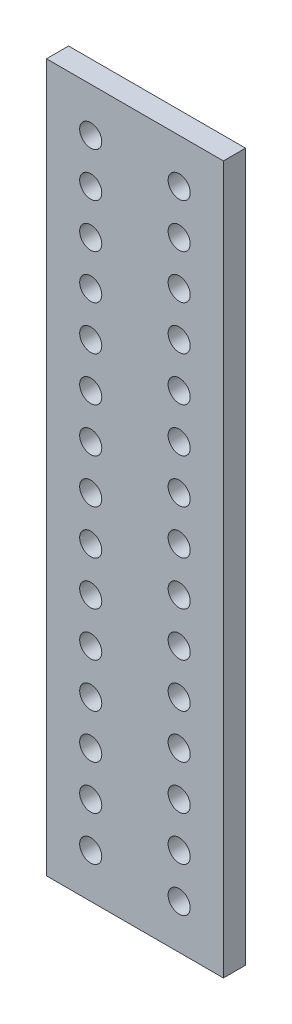
ISO-10303-21;
HEADER;
FILE_DESCRIPTION(('STEP AP214'),'2;1');
FILE_NAME('part.step','',(''),(''),'','','');
FILE_SCHEMA(('AUTOMOTIVE_DESIGN { 1 0 10303 214 1 1 1 1 }'));
ENDSEC;
DATA;
#1=APPLICATION_CONTEXT('core data for automotive mechanical design processes');
#2=APPLICATION_PROTOCOL_DEFINITION('international standard','automotive_design',2000,#1);
#3=PRODUCT_CONTEXT('',#1,'mechanical');
#4=PRODUCT('Part','Part','',(#3));
#5=PRODUCT_RELATED_PRODUCT_CATEGORY('part','',(#4));
#6=PRODUCT_DEFINITION_FORMATION('','',#4);
#7=PRODUCT_DEFINITION_CONTEXT('part definition',#1,'design');
#8=PRODUCT_DEFINITION('design','',#6,#7);
#9=PRODUCT_DEFINITION_SHAPE('','',#8);
#10=(LENGTH_UNIT() NAMED_UNIT(*) SI_UNIT(.MILLI.,.METRE.));
#11=(NAMED_UNIT(*) PLANE_ANGLE_UNIT() SI_UNIT($,.RADIAN.));
#12=(NAMED_UNIT(*) SI_UNIT($,.STERADIAN.) SOLID_ANGLE_UNIT());
#13=UNCERTAINTY_MEASURE_WITH_UNIT(LENGTH_MEASURE(1.E-05),#10,'distance_accuracy_value','');
#14=(GEOMETRIC_REPRESENTATION_CONTEXT(3) GLOBAL_UNCERTAINTY_ASSIGNED_CONTEXT((#13)) GLOBAL_UNIT_ASSIGNED_CONTEXT((#10,
#11,#12)) REPRESENTATION_CONTEXT('',''));
#15=CARTESIAN_POINT('',(0.,0.,0.));
#16=DIRECTION('',(0.,0.,1.));
#17=DIRECTION('',(1.,0.,0.));
#18=AXIS2_PLACEMENT_3D('',#15,#16,#17);
#19=CARTESIAN_POINT('',(0.,0.,6.35));
#20=DIRECTION('',(0.,0.,-1.));
#21=DIRECTION('',(-1.,0.,0.));
#22=AXIS2_PLACEMENT_3D('',#19,#20,#21);
#23=PLANE('',#22);
#24=DIRECTION('',(0.,1.,0.));
#25=VECTOR('',#24,1.);
#26=CARTESIAN_POINT('',(25.4,-101.6,6.35));
#27=LINE('',#26,#25);
#28=CARTESIAN_POINT('',(25.4,-101.6,6.35));
#29=VERTEX_POINT('',#28);
#30=CARTESIAN_POINT('',(25.4,101.6,6.35));
#31=VERTEX_POINT('',#30);
#32=EDGE_CURVE('E85',#29,#31,#27,.T.);
#33=ORIENTED_EDGE('',*,*,#32,.T.);
#34=DIRECTION('',(-1.,0.,0.));
#35=VECTOR('',#34,1.);
#36=CARTESIAN_POINT('',(-25.4,101.6,6.35));
#37=LINE('',#36,#35);
#38=CARTESIAN_POINT('',(-25.4,101.6,6.35));
#39=VERTEX_POINT('',#38);
#40=EDGE_CURVE('E80',#31,#39,#37,.T.);
#41=ORIENTED_EDGE('',*,*,#40,.T.);
#42=DIRECTION('',(0.,-1.,0.));
#43=VECTOR('',#42,1.);
#44=CARTESIAN_POINT('',(-25.4,-101.6,6.35));
#45=LINE('',#44,#43);
#46=CARTESIAN_POINT('',(-25.4,-101.6,6.35));
#47=VERTEX_POINT('',#46);
#48=EDGE_CURVE('E83',#39,#47,#45,.T.);
#49=ORIENTED_EDGE('',*,*,#48,.T.);
#50=DIRECTION('',(1.,0.,0.));
#51=VECTOR('',#50,1.);
#52=CARTESIAN_POINT('',(-25.4,-101.6,6.35));
#53=LINE('',#52,#51);
#54=EDGE_CURVE('E50',#47,#29,#53,.T.);
#55=ORIENTED_EDGE('',*,*,#54,.T.);
#56=EDGE_LOOP('',(#33,#41,#49,#55));
#57=FACE_BOUND('',#56,.T.);
#58=CARTESIAN_POINT('',(-12.7,88.9,6.35));
#59=DIRECTION('',(0.,0.,1.));
#60=DIRECTION('',(1.,0.,0.));
#61=AXIS2_PLACEMENT_3D('',#58,#59,#60);
#62=CIRCLE('',#61,3.175);
#63=CARTESIAN_POINT('',(-9.52499999999999,88.9,6.35));
#64=VERTEX_POINT('',#63);
#65=EDGE_CURVE('E100',#64,#64,#62,.T.);
#66=ORIENTED_EDGE('',*,*,#65,.F.);
#67=EDGE_LOOP('',(#66));
#68=FACE_BOUND('',#67,.T.);
#69=CARTESIAN_POINT('',(-12.6999999999985,-50.7999999999999,6.35));
#70=DIRECTION('',(0.,0.,1.));
#71=DIRECTION('',(1.,0.,0.));
#72=AXIS2_PLACEMENT_3D('',#69,#70,#71);
#73=CIRCLE('',#72,3.175);
#74=CARTESIAN_POINT('',(-9.52499999999853,-50.7999999999999,6.35));
#75=VERTEX_POINT('',#74);
#76=EDGE_CURVE('E115',#75,#75,#73,.T.);
#77=ORIENTED_EDGE('',*,*,#76,.F.);
#78=EDGE_LOOP('',(#77));
#79=FACE_BOUND('',#78,.T.);
#80=CARTESIAN_POINT('',(12.7,88.9,6.35));
#81=DIRECTION('',(0.,0.,1.));
#82=DIRECTION('',(1.,0.,0.));
#83=AXIS2_PLACEMENT_3D('',#80,#81,#82);
#84=CIRCLE('',#83,3.175);
#85=CARTESIAN_POINT('',(15.875,88.9,6.35));
#86=VERTEX_POINT('',#85);
#87=EDGE_CURVE('E121',#86,#86,#84,.T.);
#88=ORIENTED_EDGE('',*,*,#87,.F.);
#89=EDGE_LOOP('',(#88));
#90=FACE_BOUND('',#89,.T.);
#91=CARTESIAN_POINT('',(12.7000000000001,76.2,6.35));
#92=DIRECTION('',(0.,0.,1.));
#93=DIRECTION('',(1.,0.,0.));
#94=AXIS2_PLACEMENT_3D('',#91,#92,#93);
#95=CIRCLE('',#94,3.175);
#96=CARTESIAN_POINT('',(15.8750000000001,76.2,6.35));
#97=VERTEX_POINT('',#96);
#98=EDGE_CURVE('E127',#97,#97,#95,.T.);
#99=ORIENTED_EDGE('',*,*,#98,.F.);
#100=EDGE_LOOP('',(#99));
#101=FACE_BOUND('',#100,.T.);
#102=CARTESIAN_POINT('',(12.7000000000003,63.5,6.35));
#103=DIRECTION('',(0.,0.,1.));
#104=DIRECTION('',(1.,0.,0.));
#105=AXIS2_PLACEMENT_3D('',#102,#103,#104);
#106=CIRCLE('',#105,3.175);
#107=CARTESIAN_POINT('',(15.8750000000003,63.5,6.35));
#108=VERTEX_POINT('',#107);
#109=EDGE_CURVE('E133',#108,#108,#106,.T.);
#110=ORIENTED_EDGE('',*,*,#109,.F.);
#111=EDGE_LOOP('',(#110));
#112=FACE_BOUND('',#111,.T.);
#113=CARTESIAN_POINT('',(12.7000000000004,50.8,6.35));
#114=DIRECTION('',(0.,0.,1.));
#115=DIRECTION('',(1.,0.,0.));
#116=AXIS2_PLACEMENT_3D('',#113,#114,#115);
#117=CIRCLE('',#116,3.175);
#118=CARTESIAN_POINT('',(15.8750000000004,50.8,6.35));
#119=VERTEX_POINT('',#118);
#120=EDGE_CURVE('E139',#119,#119,#117,.T.);
#121=ORIENTED_EDGE('',*,*,#120,.F.);
#122=EDGE_LOOP('',(#121));
#123=FACE_BOUND('',#122,.T.);
#124=CARTESIAN_POINT('',(12.7000000000005,38.1000000000001,6.35));
#125=DIRECTION('',(0.,0.,1.));
#126=DIRECTION('',(1.,0.,0.));
#127=AXIS2_PLACEMENT_3D('',#124,#125,#126);
#128=CIRCLE('',#127,3.175);
#129=CARTESIAN_POINT('',(15.8750000000005,38.1000000000001,6.35));
#130=VERTEX_POINT('',#129);
#131=EDGE_CURVE('E145',#130,#130,#128,.T.);
#132=ORIENTED_EDGE('',*,*,#131,.F.);
#133=EDGE_LOOP('',(#132));
#134=FACE_BOUND('',#133,.T.);
#135=CARTESIAN_POINT('',(12.7000000000007,25.4000000000001,6.35));
#136=DIRECTION('',(0.,0.,1.));
#137=DIRECTION('',(1.,0.,0.));
#138=AXIS2_PLACEMENT_3D('',#135,#136,#137);
#139=CIRCLE('',#138,3.175);
#140=CARTESIAN_POINT('',(15.8750000000007,25.4000000000001,6.35));
#141=VERTEX_POINT('',#140);
#142=EDGE_CURVE('E151',#141,#141,#139,.T.);
#143=ORIENTED_EDGE('',*,*,#142,.F.);
#144=EDGE_LOOP('',(#143));
#145=FACE_BOUND('',#144,.T.);
#146=CARTESIAN_POINT('',(12.7000000000008,12.7000000000001,6.35));
#147=DIRECTION('',(0.,0.,1.));
#148=DIRECTION('',(1.,0.,0.));
#149=AXIS2_PLACEMENT_3D('',#146,#147,#148);
#150=CIRCLE('',#149,3.175);
#151=CARTESIAN_POINT('',(15.8750000000008,12.7000000000001,6.35));
#152=VERTEX_POINT('',#151);
#153=EDGE_CURVE('E157',#152,#152,#150,.T.);
#154=ORIENTED_EDGE('',*,*,#153,.F.);
#155=EDGE_LOOP('',(#154));
#156=FACE_BOUND('',#155,.T.);
#157=CARTESIAN_POINT('',(12.7000000000009,0.,6.35));
#158=DIRECTION('',(0.,0.,1.));
#159=DIRECTION('',(1.,0.,0.));
#160=AXIS2_PLACEMENT_3D('',#157,#158,#159);
#161=CIRCLE('',#160,3.175);
#162=CARTESIAN_POINT('',(15.8750000000009,0.,6.35));
#163=VERTEX_POINT('',#162);
#164=EDGE_CURVE('E163',#163,#163,#161,.T.);
#165=ORIENTED_EDGE('',*,*,#164,.F.);
#166=EDGE_LOOP('',(#165));
#167=FACE_BOUND('',#166,.T.);
#168=CARTESIAN_POINT('',(12.7000000000011,-12.6999999999999,6.35));
#169=DIRECTION('',(0.,0.,1.));
#170=DIRECTION('',(1.,0.,0.));
#171=AXIS2_PLACEMENT_3D('',#168,#169,#170);
#172=CIRCLE('',#171,3.175);
#173=CARTESIAN_POINT('',(15.8750000000011,-12.6999999999999,6.35));
#174=VERTEX_POINT('',#173);
#175=EDGE_CURVE('E169',#174,#174,#172,.T.);
#176=ORIENTED_EDGE('',*,*,#175,.F.);
#177=EDGE_LOOP('',(#176));
#178=FACE_BOUND('',#177,.T.);
#179=CARTESIAN_POINT('',(12.7000000000012,-25.3999999999999,6.35));
#180=DIRECTION('',(0.,0.,1.));
#181=DIRECTION('',(1.,0.,0.));
#182=AXIS2_PLACEMENT_3D('',#179,#180,#181);
#183=CIRCLE('',#182,3.175);
#184=CARTESIAN_POINT('',(15.8750000000012,-25.3999999999999,6.35));
#185=VERTEX_POINT('',#184);
#186=EDGE_CURVE('E175',#185,#185,#183,.T.);
#187=ORIENTED_EDGE('',*,*,#186,.F.);
#188=EDGE_LOOP('',(#187));
#189=FACE_BOUND('',#188,.T.);
#190=CARTESIAN_POINT('',(12.7000000000013,-38.0999999999999,6.35));
#191=DIRECTION('',(0.,0.,1.));
#192=DIRECTION('',(1.,0.,0.));
#193=AXIS2_PLACEMENT_3D('',#190,#191,#192);
#194=CIRCLE('',#193,3.175);
#195=CARTESIAN_POINT('',(15.8750000000013,-38.0999999999999,6.35));
#196=VERTEX_POINT('',#195);
#197=EDGE_CURVE('E181',#196,#196,#194,.T.);
#198=ORIENTED_EDGE('',*,*,#197,.F.);
#199=EDGE_LOOP('',(#198));
#200=FACE_BOUND('',#199,.T.);
#201=CARTESIAN_POINT('',(12.7000000000015,-50.7999999999999,6.35));
#202=DIRECTION('',(0.,0.,1.));
#203=DIRECTION('',(1.,0.,0.));
#204=AXIS2_PLACEMENT_3D('',#201,#202,#203);
#205=CIRCLE('',#204,3.175);
#206=CARTESIAN_POINT('',(15.8750000000015,-50.7999999999999,6.35));
#207=VERTEX_POINT('',#206);
#208=EDGE_CURVE('E187',#207,#207,#205,.T.);
#209=ORIENTED_EDGE('',*,*,#208,.F.);
#210=EDGE_LOOP('',(#209));
#211=FACE_BOUND('',#210,.T.);
#212=CARTESIAN_POINT('',(-12.6999999999984,-63.4999999999999,6.35));
#213=DIRECTION('',(0.,0.,1.));
#214=DIRECTION('',(1.,0.,0.));
#215=AXIS2_PLACEMENT_3D('',#212,#213,#214);
#216=CIRCLE('',#215,3.175);
#217=CARTESIAN_POINT('',(-9.5249999999984,-63.4999999999999,6.35));
#218=VERTEX_POINT('',#217);
#219=EDGE_CURVE('E193',#218,#218,#216,.T.);
#220=ORIENTED_EDGE('',*,*,#219,.F.);
#221=EDGE_LOOP('',(#220));
#222=FACE_BOUND('',#221,.T.);
#223=CARTESIAN_POINT('',(12.7000000000016,-63.4999999999999,6.35));
#224=DIRECTION('',(0.,0.,1.));
#225=DIRECTION('',(1.,0.,0.));
#226=AXIS2_PLACEMENT_3D('',#223,#224,#225);
#227=CIRCLE('',#226,3.175);
#228=CARTESIAN_POINT('',(15.8750000000016,-63.4999999999999,6.35));
#229=VERTEX_POINT('',#228);
#230=EDGE_CURVE('E199',#229,#229,#227,.T.);
#231=ORIENTED_EDGE('',*,*,#230,.F.);
#232=EDGE_LOOP('',(#231));
#233=FACE_BOUND('',#232,.T.);
#234=CARTESIAN_POINT('',(-12.6999999999983,-76.1999999999998,6.35));
#235=DIRECTION('',(0.,0.,1.));
#236=DIRECTION('',(1.,0.,0.));
#237=AXIS2_PLACEMENT_3D('',#234,#235,#236);
#238=CIRCLE('',#237,3.175);
#239=CARTESIAN_POINT('',(-9.52499999999826,-76.1999999999998,6.35));
#240=VERTEX_POINT('',#239);
#241=EDGE_CURVE('E205',#240,#240,#238,.T.);
#242=ORIENTED_EDGE('',*,*,#241,.F.);
#243=EDGE_LOOP('',(#242));
#244=FACE_BOUND('',#243,.T.);
#245=CARTESIAN_POINT('',(12.7000000000017,-76.1999999999998,6.35));
#246=DIRECTION('',(0.,0.,1.));
#247=DIRECTION('',(1.,0.,0.));
#248=AXIS2_PLACEMENT_3D('',#245,#246,#247);
#249=CIRCLE('',#248,3.175);
#250=CARTESIAN_POINT('',(15.8750000000017,-76.1999999999998,6.35));
#251=VERTEX_POINT('',#250);
#252=EDGE_CURVE('E211',#251,#251,#249,.T.);
#253=ORIENTED_EDGE('',*,*,#252,.F.);
#254=EDGE_LOOP('',(#253));
#255=FACE_BOUND('',#254,.T.);
#256=CARTESIAN_POINT('',(-12.6999999999981,-88.8999999999998,6.35));
#257=DIRECTION('',(0.,0.,1.));
#258=DIRECTION('',(1.,0.,0.));
#259=AXIS2_PLACEMENT_3D('',#256,#257,#258);
#260=CIRCLE('',#259,3.175);
#261=CARTESIAN_POINT('',(-9.52499999999813,-88.8999999999998,6.35));
#262=VERTEX_POINT('',#261);
#263=EDGE_CURVE('E217',#262,#262,#260,.T.);
#264=ORIENTED_EDGE('',*,*,#263,.F.);
#265=EDGE_LOOP('',(#264));
#266=FACE_BOUND('',#265,.T.);
#267=CARTESIAN_POINT('',(12.7000000000019,-88.8999999999998,6.35));
#268=DIRECTION('',(0.,0.,1.));
#269=DIRECTION('',(1.,0.,0.));
#270=AXIS2_PLACEMENT_3D('',#267,#268,#269);
#271=CIRCLE('',#270,3.175);
#272=CARTESIAN_POINT('',(15.8750000000019,-88.8999999999998,6.35));
#273=VERTEX_POINT('',#272);
#274=EDGE_CURVE('E223',#273,#273,#271,.T.);
#275=ORIENTED_EDGE('',*,*,#274,.F.);
#276=EDGE_LOOP('',(#275));
#277=FACE_BOUND('',#276,.T.);
#278=CARTESIAN_POINT('',(-12.6999999999999,76.2,6.35));
#279=DIRECTION('',(0.,0.,1.));
#280=DIRECTION('',(1.,0.,0.));
#281=AXIS2_PLACEMENT_3D('',#278,#279,#280);
#282=CIRCLE('',#281,3.175);
#283=CARTESIAN_POINT('',(-9.52499999999986,76.2,6.35));
#284=VERTEX_POINT('',#283);
#285=EDGE_CURVE('E229',#284,#284,#282,.T.);
#286=ORIENTED_EDGE('',*,*,#285,.F.);
#287=EDGE_LOOP('',(#286));
#288=FACE_BOUND('',#287,.T.);
#289=CARTESIAN_POINT('',(-12.6999999999997,63.5,6.35));
#290=DIRECTION('',(0.,0.,1.));
#291=DIRECTION('',(1.,0.,0.));
#292=AXIS2_PLACEMENT_3D('',#289,#290,#291);
#293=CIRCLE('',#292,3.175);
#294=CARTESIAN_POINT('',(-9.52499999999973,63.5,6.35));
#295=VERTEX_POINT('',#294);
#296=EDGE_CURVE('E235',#295,#295,#293,.T.);
#297=ORIENTED_EDGE('',*,*,#296,.F.);
#298=EDGE_LOOP('',(#297));
#299=FACE_BOUND('',#298,.T.);
#300=CARTESIAN_POINT('',(-12.6999999999996,50.8,6.35));
#301=DIRECTION('',(0.,0.,1.));
#302=DIRECTION('',(1.,0.,0.));
#303=AXIS2_PLACEMENT_3D('',#300,#301,#302);
#304=CIRCLE('',#303,3.175);
#305=CARTESIAN_POINT('',(-9.52499999999959,50.8,6.35));
#306=VERTEX_POINT('',#305);
#307=EDGE_CURVE('E241',#306,#306,#304,.T.);
#308=ORIENTED_EDGE('',*,*,#307,.F.);
#309=EDGE_LOOP('',(#308));
#310=FACE_BOUND('',#309,.T.);
#311=CARTESIAN_POINT('',(-12.6999999999995,38.1000000000001,6.35));
#312=DIRECTION('',(0.,0.,1.));
#313=DIRECTION('',(1.,0.,0.));
#314=AXIS2_PLACEMENT_3D('',#311,#312,#313);
#315=CIRCLE('',#314,3.175);
#316=CARTESIAN_POINT('',(-9.52499999999946,38.1000000000001,6.35));
#317=VERTEX_POINT('',#316);
#318=EDGE_CURVE('E247',#317,#317,#315,.T.);
#319=ORIENTED_EDGE('',*,*,#318,.F.);
#320=EDGE_LOOP('',(#319));
#321=FACE_BOUND('',#320,.T.);
#322=CARTESIAN_POINT('',(-12.6999999999993,25.4000000000001,6.35));
#323=DIRECTION('',(0.,0.,1.));
#324=DIRECTION('',(1.,0.,0.));
#325=AXIS2_PLACEMENT_3D('',#322,#323,#324);
#326=CIRCLE('',#325,3.175);
#327=CARTESIAN_POINT('',(-9.52499999999933,25.4000000000001,6.35));
#328=VERTEX_POINT('',#327);
#329=EDGE_CURVE('E253',#328,#328,#326,.T.);
#330=ORIENTED_EDGE('',*,*,#329,.F.);
#331=EDGE_LOOP('',(#330));
#332=FACE_BOUND('',#331,.T.);
#333=CARTESIAN_POINT('',(-12.6999999999992,12.7000000000001,6.35));
#334=DIRECTION('',(0.,0.,1.));
#335=DIRECTION('',(1.,0.,0.));
#336=AXIS2_PLACEMENT_3D('',#333,#334,#335);
#337=CIRCLE('',#336,3.175);
#338=CARTESIAN_POINT('',(-9.52499999999919,12.7000000000001,6.35));
#339=VERTEX_POINT('',#338);
#340=EDGE_CURVE('E259',#339,#339,#337,.T.);
#341=ORIENTED_EDGE('',*,*,#340,.F.);
#342=EDGE_LOOP('',(#341));
#343=FACE_BOUND('',#342,.T.);
#344=CARTESIAN_POINT('',(-12.6999999999991,0.,6.35));
#345=DIRECTION('',(0.,0.,1.));
#346=DIRECTION('',(1.,0.,0.));
#347=AXIS2_PLACEMENT_3D('',#344,#345,#346);
#348=CIRCLE('',#347,3.175);
#349=CARTESIAN_POINT('',(-9.52499999999906,0.,6.35));
#350=VERTEX_POINT('',#349);
#351=EDGE_CURVE('E265',#350,#350,#348,.T.);
#352=ORIENTED_EDGE('',*,*,#351,.F.);
#353=EDGE_LOOP('',(#352));
#354=FACE_BOUND('',#353,.T.);
#355=CARTESIAN_POINT('',(-12.6999999999989,-12.6999999999999,6.35));
#356=DIRECTION('',(0.,0.,1.));
#357=DIRECTION('',(1.,0.,0.));
#358=AXIS2_PLACEMENT_3D('',#355,#356,#357);
#359=CIRCLE('',#358,3.175);
#360=CARTESIAN_POINT('',(-9.52499999999893,-12.6999999999999,6.35));
#361=VERTEX_POINT('',#360);
#362=EDGE_CURVE('E271',#361,#361,#359,.T.);
#363=ORIENTED_EDGE('',*,*,#362,.F.);
#364=EDGE_LOOP('',(#363));
#365=FACE_BOUND('',#364,.T.);
#366=CARTESIAN_POINT('',(-12.6999999999988,-25.3999999999999,6.35));
#367=DIRECTION('',(0.,0.,1.));
#368=DIRECTION('',(1.,0.,0.));
#369=AXIS2_PLACEMENT_3D('',#366,#367,#368);
#370=CIRCLE('',#369,3.175);
#371=CARTESIAN_POINT('',(-9.52499999999879,-25.3999999999999,6.35));
#372=VERTEX_POINT('',#371);
#373=EDGE_CURVE('E277',#372,#372,#370,.T.);
#374=ORIENTED_EDGE('',*,*,#373,.F.);
#375=EDGE_LOOP('',(#374));
#376=FACE_BOUND('',#375,.T.);
#377=CARTESIAN_POINT('',(-12.6999999999987,-38.0999999999999,6.35));
#378=DIRECTION('',(0.,0.,1.));
#379=DIRECTION('',(1.,0.,0.));
#380=AXIS2_PLACEMENT_3D('',#377,#378,#379);
#381=CIRCLE('',#380,3.175);
#382=CARTESIAN_POINT('',(-9.52499999999866,-38.0999999999999,6.35));
#383=VERTEX_POINT('',#382);
#384=EDGE_CURVE('E283',#383,#383,#381,.T.);
#385=ORIENTED_EDGE('',*,*,#384,.F.);
#386=EDGE_LOOP('',(#385));
#387=FACE_BOUND('',#386,.T.);
#388=ADVANCED_FACE('F33',(#57,#68,#79,#90,#101,#112,#123,#134,#145,#156,#167,#178,#189,#200,
#211,#222,#233,#244,#255,#266,#277,#288,#299,#310,#321,#332,#343,#354,#365,#376,#387),#23,.F.);
#389=CARTESIAN_POINT('',(0.,0.,0.));
#390=DIRECTION('',(0.,0.,-1.));
#391=DIRECTION('',(-1.,0.,0.));
#392=AXIS2_PLACEMENT_3D('',#389,#390,#391);
#393=PLANE('',#392);
#394=CARTESIAN_POINT('',(-12.6999999999988,-25.3999999999999,0.));
#395=DIRECTION('',(0.,0.,1.));
#396=DIRECTION('',(1.,0.,0.));
#397=AXIS2_PLACEMENT_3D('',#394,#395,#396);
#398=CIRCLE('',#397,3.175);
#399=CARTESIAN_POINT('',(-9.52499999999879,-25.3999999999999,0.));
#400=VERTEX_POINT('',#399);
#401=EDGE_CURVE('E280',#400,#400,#398,.T.);
#402=ORIENTED_EDGE('',*,*,#401,.T.);
#403=EDGE_LOOP('',(#402));
#404=FACE_BOUND('',#403,.T.);
#405=CARTESIAN_POINT('',(-12.6999999999991,0.,0.));
#406=DIRECTION('',(0.,0.,1.));
#407=DIRECTION('',(1.,0.,0.));
#408=AXIS2_PLACEMENT_3D('',#405,#406,#407);
#409=CIRCLE('',#408,3.175);
#410=CARTESIAN_POINT('',(-9.52499999999906,0.,0.));
#411=VERTEX_POINT('',#410);
#412=EDGE_CURVE('E268',#411,#411,#409,.T.);
#413=ORIENTED_EDGE('',*,*,#412,.T.);
#414=EDGE_LOOP('',(#413));
#415=FACE_BOUND('',#414,.T.);
#416=CARTESIAN_POINT('',(-12.6999999999993,25.4000000000001,0.));
#417=DIRECTION('',(0.,0.,1.));
#418=DIRECTION('',(1.,0.,0.));
#419=AXIS2_PLACEMENT_3D('',#416,#417,#418);
#420=CIRCLE('',#419,3.175);
#421=CARTESIAN_POINT('',(-9.52499999999933,25.4000000000001,0.));
#422=VERTEX_POINT('',#421);
#423=EDGE_CURVE('E256',#422,#422,#420,.T.);
#424=ORIENTED_EDGE('',*,*,#423,.T.);
#425=EDGE_LOOP('',(#424));
#426=FACE_BOUND('',#425,.T.);
#427=CARTESIAN_POINT('',(-12.6999999999996,50.8,0.));
#428=DIRECTION('',(0.,0.,1.));
#429=DIRECTION('',(1.,0.,0.));
#430=AXIS2_PLACEMENT_3D('',#427,#428,#429);
#431=CIRCLE('',#430,3.175);
#432=CARTESIAN_POINT('',(-9.52499999999959,50.8,0.));
#433=VERTEX_POINT('',#432);
#434=EDGE_CURVE('E244',#433,#433,#431,.T.);
#435=ORIENTED_EDGE('',*,*,#434,.T.);
#436=EDGE_LOOP('',(#435));
#437=FACE_BOUND('',#436,.T.);
#438=CARTESIAN_POINT('',(-12.6999999999999,76.2,0.));
#439=DIRECTION('',(0.,0.,1.));
#440=DIRECTION('',(1.,0.,0.));
#441=AXIS2_PLACEMENT_3D('',#438,#439,#440);
#442=CIRCLE('',#441,3.175);
#443=CARTESIAN_POINT('',(-9.52499999999986,76.2,0.));
#444=VERTEX_POINT('',#443);
#445=EDGE_CURVE('E232',#444,#444,#442,.T.);
#446=ORIENTED_EDGE('',*,*,#445,.T.);
#447=EDGE_LOOP('',(#446));
#448=FACE_BOUND('',#447,.T.);
#449=CARTESIAN_POINT('',(-12.6999999999981,-88.8999999999998,0.));
#450=DIRECTION('',(0.,0.,1.));
#451=DIRECTION('',(1.,0.,0.));
#452=AXIS2_PLACEMENT_3D('',#449,#450,#451);
#453=CIRCLE('',#452,3.175);
#454=CARTESIAN_POINT('',(-9.52499999999813,-88.8999999999998,0.));
#455=VERTEX_POINT('',#454);
#456=EDGE_CURVE('E220',#455,#455,#453,.T.);
#457=ORIENTED_EDGE('',*,*,#456,.T.);
#458=EDGE_LOOP('',(#457));
#459=FACE_BOUND('',#458,.T.);
#460=CARTESIAN_POINT('',(-12.6999999999983,-76.1999999999998,0.));
#461=DIRECTION('',(0.,0.,1.));
#462=DIRECTION('',(1.,0.,0.));
#463=AXIS2_PLACEMENT_3D('',#460,#461,#462);
#464=CIRCLE('',#463,3.175);
#465=CARTESIAN_POINT('',(-9.52499999999826,-76.1999999999998,0.));
#466=VERTEX_POINT('',#465);
#467=EDGE_CURVE('E208',#466,#466,#464,.T.);
#468=ORIENTED_EDGE('',*,*,#467,.T.);
#469=EDGE_LOOP('',(#468));
#470=FACE_BOUND('',#469,.T.);
#471=CARTESIAN_POINT('',(-12.6999999999984,-63.4999999999999,0.));
#472=DIRECTION('',(0.,0.,1.));
#473=DIRECTION('',(1.,0.,0.));
#474=AXIS2_PLACEMENT_3D('',#471,#472,#473);
#475=CIRCLE('',#474,3.175);
#476=CARTESIAN_POINT('',(-9.5249999999984,-63.4999999999999,0.));
#477=VERTEX_POINT('',#476);
#478=EDGE_CURVE('E196',#477,#477,#475,.T.);
#479=ORIENTED_EDGE('',*,*,#478,.T.);
#480=EDGE_LOOP('',(#479));
#481=FACE_BOUND('',#480,.T.);
#482=CARTESIAN_POINT('',(12.7000000000013,-38.0999999999999,0.));
#483=DIRECTION('',(0.,0.,1.));
#484=DIRECTION('',(1.,0.,0.));
#485=AXIS2_PLACEMENT_3D('',#482,#483,#484);
#486=CIRCLE('',#485,3.175);
#487=CARTESIAN_POINT('',(15.8750000000013,-38.0999999999999,0.));
#488=VERTEX_POINT('',#487);
#489=EDGE_CURVE('E184',#488,#488,#486,.T.);
#490=ORIENTED_EDGE('',*,*,#489,.T.);
#491=EDGE_LOOP('',(#490));
#492=FACE_BOUND('',#491,.T.);
#493=CARTESIAN_POINT('',(12.7000000000011,-12.6999999999999,0.));
#494=DIRECTION('',(0.,0.,1.));
#495=DIRECTION('',(1.,0.,0.));
#496=AXIS2_PLACEMENT_3D('',#493,#494,#495);
#497=CIRCLE('',#496,3.175);
#498=CARTESIAN_POINT('',(15.8750000000011,-12.6999999999999,0.));
#499=VERTEX_POINT('',#498);
#500=EDGE_CURVE('E172',#499,#499,#497,.T.);
#501=ORIENTED_EDGE('',*,*,#500,.T.);
#502=EDGE_LOOP('',(#501));
#503=FACE_BOUND('',#502,.T.);
#504=CARTESIAN_POINT('',(12.7000000000008,12.7000000000001,0.));
#505=DIRECTION('',(0.,0.,1.));
#506=DIRECTION('',(1.,0.,0.));
#507=AXIS2_PLACEMENT_3D('',#504,#505,#506);
#508=CIRCLE('',#507,3.175);
#509=CARTESIAN_POINT('',(15.8750000000008,12.7000000000001,0.));
#510=VERTEX_POINT('',#509);
#511=EDGE_CURVE('E160',#510,#510,#508,.T.);
#512=ORIENTED_EDGE('',*,*,#511,.T.);
#513=EDGE_LOOP('',(#512));
#514=FACE_BOUND('',#513,.T.);
#515=CARTESIAN_POINT('',(12.7000000000005,38.1000000000001,0.));
#516=DIRECTION('',(0.,0.,1.));
#517=DIRECTION('',(1.,0.,0.));
#518=AXIS2_PLACEMENT_3D('',#515,#516,#517);
#519=CIRCLE('',#518,3.175);
#520=CARTESIAN_POINT('',(15.8750000000005,38.1000000000001,0.));
#521=VERTEX_POINT('',#520);
#522=EDGE_CURVE('E148',#521,#521,#519,.T.);
#523=ORIENTED_EDGE('',*,*,#522,.T.);
#524=EDGE_LOOP('',(#523));
#525=FACE_BOUND('',#524,.T.);
#526=CARTESIAN_POINT('',(12.7000000000003,63.5,0.));
#527=DIRECTION('',(0.,0.,1.));
#528=DIRECTION('',(1.,0.,0.));
#529=AXIS2_PLACEMENT_3D('',#526,#527,#528);
#530=CIRCLE('',#529,3.175);
#531=CARTESIAN_POINT('',(15.8750000000003,63.5,0.));
#532=VERTEX_POINT('',#531);
#533=EDGE_CURVE('E136',#532,#532,#530,.T.);
#534=ORIENTED_EDGE('',*,*,#533,.T.);
#535=EDGE_LOOP('',(#534));
#536=FACE_BOUND('',#535,.T.);
#537=CARTESIAN_POINT('',(12.7,88.9,0.));
#538=DIRECTION('',(0.,0.,1.));
#539=DIRECTION('',(1.,0.,0.));
#540=AXIS2_PLACEMENT_3D('',#537,#538,#539);
#541=CIRCLE('',#540,3.175);
#542=CARTESIAN_POINT('',(15.875,88.9,0.));
#543=VERTEX_POINT('',#542);
#544=EDGE_CURVE('E124',#543,#543,#541,.T.);
#545=ORIENTED_EDGE('',*,*,#544,.T.);
#546=EDGE_LOOP('',(#545));
#547=FACE_BOUND('',#546,.T.);
#548=CARTESIAN_POINT('',(-12.7,88.9,0.));
#549=DIRECTION('',(0.,0.,1.));
#550=DIRECTION('',(1.,0.,0.));
#551=AXIS2_PLACEMENT_3D('',#548,#549,#550);
#552=CIRCLE('',#551,3.175);
#553=CARTESIAN_POINT('',(-9.52499999999999,88.9,0.));
#554=VERTEX_POINT('',#553);
#555=EDGE_CURVE('E112',#554,#554,#552,.T.);
#556=ORIENTED_EDGE('',*,*,#555,.T.);
#557=EDGE_LOOP('',(#556));
#558=FACE_BOUND('',#557,.T.);
#559=DIRECTION('',(0.,1.,0.));
#560=VECTOR('',#559,1.);
#561=CARTESIAN_POINT('',(25.4,-101.6,0.));
#562=LINE('',#561,#560);
#563=CARTESIAN_POINT('',(25.4,-101.6,0.));
#564=VERTEX_POINT('',#563);
#565=CARTESIAN_POINT('',(25.4,101.6,0.));
#566=VERTEX_POINT('',#565);
#567=EDGE_CURVE('E97',#564,#566,#562,.T.);
#568=ORIENTED_EDGE('',*,*,#567,.F.);
#569=DIRECTION('',(1.,0.,0.));
#570=VECTOR('',#569,1.);
#571=CARTESIAN_POINT('',(-25.4,-101.6,0.));
#572=LINE('',#571,#570);
#573=CARTESIAN_POINT('',(-25.4,-101.6,0.));
#574=VERTEX_POINT('',#573);
#575=EDGE_CURVE('E73',#574,#564,#572,.T.);
#576=ORIENTED_EDGE('',*,*,#575,.F.);
#577=DIRECTION('',(0.,-1.,0.));
#578=VECTOR('',#577,1.);
#579=CARTESIAN_POINT('',(-25.4,-101.6,0.));
#580=LINE('',#579,#578);
#581=CARTESIAN_POINT('',(-25.4,101.6,0.));
#582=VERTEX_POINT('',#581);
#583=EDGE_CURVE('E67',#582,#574,#580,.T.);
#584=ORIENTED_EDGE('',*,*,#583,.F.);
#585=DIRECTION('',(-1.,0.,0.));
#586=VECTOR('',#585,1.);
#587=CARTESIAN_POINT('',(-25.4,101.6,0.));
#588=LINE('',#587,#586);
#589=EDGE_CURVE('E89',#566,#582,#588,.T.);
#590=ORIENTED_EDGE('',*,*,#589,.F.);
#591=EDGE_LOOP('',(#568,#576,#584,#590));
#592=FACE_BOUND('',#591,.T.);
#593=CARTESIAN_POINT('',(-12.6999999999985,-50.7999999999999,0.));
#594=DIRECTION('',(0.,0.,1.));
#595=DIRECTION('',(1.,0.,0.));
#596=AXIS2_PLACEMENT_3D('',#593,#594,#595);
#597=CIRCLE('',#596,3.175);
#598=CARTESIAN_POINT('',(-9.52499999999853,-50.7999999999999,0.));
#599=VERTEX_POINT('',#598);
#600=EDGE_CURVE('E118',#599,#599,#597,.T.);
#601=ORIENTED_EDGE('',*,*,#600,.T.);
#602=EDGE_LOOP('',(#601));
#603=FACE_BOUND('',#602,.T.);
#604=CARTESIAN_POINT('',(12.7000000000001,76.2,0.));
#605=DIRECTION('',(0.,0.,1.));
#606=DIRECTION('',(1.,0.,0.));
#607=AXIS2_PLACEMENT_3D('',#604,#605,#606);
#608=CIRCLE('',#607,3.175);
#609=CARTESIAN_POINT('',(15.8750000000001,76.2,0.));
#610=VERTEX_POINT('',#609);
#611=EDGE_CURVE('E130',#610,#610,#608,.T.);
#612=ORIENTED_EDGE('',*,*,#611,.T.);
#613=EDGE_LOOP('',(#612));
#614=FACE_BOUND('',#613,.T.);
#615=CARTESIAN_POINT('',(12.7000000000004,50.8,0.));
#616=DIRECTION('',(0.,0.,1.));
#617=DIRECTION('',(1.,0.,0.));
#618=AXIS2_PLACEMENT_3D('',#615,#616,#617);
#619=CIRCLE('',#618,3.175);
#620=CARTESIAN_POINT('',(15.8750000000004,50.8,0.));
#621=VERTEX_POINT('',#620);
#622=EDGE_CURVE('E142',#621,#621,#619,.T.);
#623=ORIENTED_EDGE('',*,*,#622,.T.);
#624=EDGE_LOOP('',(#623));
#625=FACE_BOUND('',#624,.T.);
#626=CARTESIAN_POINT('',(12.7000000000007,25.4000000000001,0.));
#627=DIRECTION('',(0.,0.,1.));
#628=DIRECTION('',(1.,0.,0.));
#629=AXIS2_PLACEMENT_3D('',#626,#627,#628);
#630=CIRCLE('',#629,3.175);
#631=CARTESIAN_POINT('',(15.8750000000007,25.4000000000001,0.));
#632=VERTEX_POINT('',#631);
#633=EDGE_CURVE('E154',#632,#632,#630,.T.);
#634=ORIENTED_EDGE('',*,*,#633,.T.);
#635=EDGE_LOOP('',(#634));
#636=FACE_BOUND('',#635,.T.);
#637=CARTESIAN_POINT('',(12.7000000000009,0.,0.));
#638=DIRECTION('',(0.,0.,1.));
#639=DIRECTION('',(1.,0.,0.));
#640=AXIS2_PLACEMENT_3D('',#637,#638,#639);
#641=CIRCLE('',#640,3.175);
#642=CARTESIAN_POINT('',(15.8750000000009,0.,0.));
#643=VERTEX_POINT('',#642);
#644=EDGE_CURVE('E166',#643,#643,#641,.T.);
#645=ORIENTED_EDGE('',*,*,#644,.T.);
#646=EDGE_LOOP('',(#645));
#647=FACE_BOUND('',#646,.T.);
#648=CARTESIAN_POINT('',(12.7000000000012,-25.3999999999999,0.));
#649=DIRECTION('',(0.,0.,1.));
#650=DIRECTION('',(1.,0.,0.));
#651=AXIS2_PLACEMENT_3D('',#648,#649,#650);
#652=CIRCLE('',#651,3.175);
#653=CARTESIAN_POINT('',(15.8750000000012,-25.3999999999999,0.));
#654=VERTEX_POINT('',#653);
#655=EDGE_CURVE('E178',#654,#654,#652,.T.);
#656=ORIENTED_EDGE('',*,*,#655,.T.);
#657=EDGE_LOOP('',(#656));
#658=FACE_BOUND('',#657,.T.);
#659=CARTESIAN_POINT('',(12.7000000000015,-50.7999999999999,0.));
#660=DIRECTION('',(0.,0.,1.));
#661=DIRECTION('',(1.,0.,0.));
#662=AXIS2_PLACEMENT_3D('',#659,#660,#661);
#663=CIRCLE('',#662,3.175);
#664=CARTESIAN_POINT('',(15.8750000000015,-50.7999999999999,0.));
#665=VERTEX_POINT('',#664);
#666=EDGE_CURVE('E190',#665,#665,#663,.T.);
#667=ORIENTED_EDGE('',*,*,#666,.T.);
#668=EDGE_LOOP('',(#667));
#669=FACE_BOUND('',#668,.T.);
#670=CARTESIAN_POINT('',(12.7000000000016,-63.4999999999999,0.));
#671=DIRECTION('',(0.,0.,1.));
#672=DIRECTION('',(1.,0.,0.));
#673=AXIS2_PLACEMENT_3D('',#670,#671,#672);
#674=CIRCLE('',#673,3.175);
#675=CARTESIAN_POINT('',(15.8750000000016,-63.4999999999999,0.));
#676=VERTEX_POINT('',#675);
#677=EDGE_CURVE('E202',#676,#676,#674,.T.);
#678=ORIENTED_EDGE('',*,*,#677,.T.);
#679=EDGE_LOOP('',(#678));
#680=FACE_BOUND('',#679,.T.);
#681=CARTESIAN_POINT('',(12.7000000000017,-76.1999999999998,0.));
#682=DIRECTION('',(0.,0.,1.));
#683=DIRECTION('',(1.,0.,0.));
#684=AXIS2_PLACEMENT_3D('',#681,#682,#683);
#685=CIRCLE('',#684,3.175);
#686=CARTESIAN_POINT('',(15.8750000000017,-76.1999999999998,0.));
#687=VERTEX_POINT('',#686);
#688=EDGE_CURVE('E214',#687,#687,#685,.T.);
#689=ORIENTED_EDGE('',*,*,#688,.T.);
#690=EDGE_LOOP('',(#689));
#691=FACE_BOUND('',#690,.T.);
#692=CARTESIAN_POINT('',(12.7000000000019,-88.8999999999998,0.));
#693=DIRECTION('',(0.,0.,1.));
#694=DIRECTION('',(1.,0.,0.));
#695=AXIS2_PLACEMENT_3D('',#692,#693,#694);
#696=CIRCLE('',#695,3.175);
#697=CARTESIAN_POINT('',(15.8750000000019,-88.8999999999998,0.));
#698=VERTEX_POINT('',#697);
#699=EDGE_CURVE('E226',#698,#698,#696,.T.);
#700=ORIENTED_EDGE('',*,*,#699,.T.);
#701=EDGE_LOOP('',(#700));
#702=FACE_BOUND('',#701,.T.);
#703=CARTESIAN_POINT('',(-12.6999999999997,63.5,0.));
#704=DIRECTION('',(0.,0.,1.));
#705=DIRECTION('',(1.,0.,0.));
#706=AXIS2_PLACEMENT_3D('',#703,#704,#705);
#707=CIRCLE('',#706,3.175);
#708=CARTESIAN_POINT('',(-9.52499999999973,63.5,0.));
#709=VERTEX_POINT('',#708);
#710=EDGE_CURVE('E238',#709,#709,#707,.T.);
#711=ORIENTED_EDGE('',*,*,#710,.T.);
#712=EDGE_LOOP('',(#711));
#713=FACE_BOUND('',#712,.T.);
#714=CARTESIAN_POINT('',(-12.6999999999995,38.1000000000001,0.));
#715=DIRECTION('',(0.,0.,1.));
#716=DIRECTION('',(1.,0.,0.));
#717=AXIS2_PLACEMENT_3D('',#714,#715,#716);
#718=CIRCLE('',#717,3.175);
#719=CARTESIAN_POINT('',(-9.52499999999946,38.1000000000001,0.));
#720=VERTEX_POINT('',#719);
#721=EDGE_CURVE('E250',#720,#720,#718,.T.);
#722=ORIENTED_EDGE('',*,*,#721,.T.);
#723=EDGE_LOOP('',(#722));
#724=FACE_BOUND('',#723,.T.);
#725=CARTESIAN_POINT('',(-12.6999999999992,12.7000000000001,0.));
#726=DIRECTION('',(0.,0.,1.));
#727=DIRECTION('',(1.,0.,0.));
#728=AXIS2_PLACEMENT_3D('',#725,#726,#727);
#729=CIRCLE('',#728,3.175);
#730=CARTESIAN_POINT('',(-9.52499999999919,12.7000000000001,0.));
#731=VERTEX_POINT('',#730);
#732=EDGE_CURVE('E262',#731,#731,#729,.T.);
#733=ORIENTED_EDGE('',*,*,#732,.T.);
#734=EDGE_LOOP('',(#733));
#735=FACE_BOUND('',#734,.T.);
#736=CARTESIAN_POINT('',(-12.6999999999989,-12.6999999999999,0.));
#737=DIRECTION('',(0.,0.,1.));
#738=DIRECTION('',(1.,0.,0.));
#739=AXIS2_PLACEMENT_3D('',#736,#737,#738);
#740=CIRCLE('',#739,3.175);
#741=CARTESIAN_POINT('',(-9.52499999999893,-12.6999999999999,0.));
#742=VERTEX_POINT('',#741);
#743=EDGE_CURVE('E274',#742,#742,#740,.T.);
#744=ORIENTED_EDGE('',*,*,#743,.T.);
#745=EDGE_LOOP('',(#744));
#746=FACE_BOUND('',#745,.T.);
#747=CARTESIAN_POINT('',(-12.6999999999987,-38.0999999999999,0.));
#748=DIRECTION('',(0.,0.,1.));
#749=DIRECTION('',(1.,0.,0.));
#750=AXIS2_PLACEMENT_3D('',#747,#748,#749);
#751=CIRCLE('',#750,3.175);
#752=CARTESIAN_POINT('',(-9.52499999999866,-38.0999999999999,0.));
#753=VERTEX_POINT('',#752);
#754=EDGE_CURVE('E286',#753,#753,#751,.T.);
#755=ORIENTED_EDGE('',*,*,#754,.T.);
#756=EDGE_LOOP('',(#755));
#757=FACE_BOUND('',#756,.T.);
#758=ADVANCED_FACE('F108',(#404,#415,#426,#437,#448,#459,#470,#481,#492,#503,#514,#525,#536,
#547,#558,#592,#603,#614,#625,#636,#647,#658,#669,#680,#691,#702,#713,#724,#735,#746,#757),#393,.T.);
#759=CARTESIAN_POINT('',(25.4,-101.6,6.35));
#760=DIRECTION('',(-1.,0.,0.));
#761=DIRECTION('',(0.,0.,1.));
#762=AXIS2_PLACEMENT_3D('',#759,#760,#761);
#763=PLANE('',#762);
#764=ORIENTED_EDGE('',*,*,#567,.T.);
#765=DIRECTION('',(0.,0.,-1.));
#766=VECTOR('',#765,1.);
#767=CARTESIAN_POINT('',(25.4,101.6,6.35));
#768=LINE('',#767,#766);
#769=EDGE_CURVE('E11',#31,#566,#768,.T.);
#770=ORIENTED_EDGE('',*,*,#769,.F.);
#771=ORIENTED_EDGE('',*,*,#32,.F.);
#772=DIRECTION('',(0.,0.,-1.));
#773=VECTOR('',#772,1.);
#774=CARTESIAN_POINT('',(25.4,-101.6,6.35));
#775=LINE('',#774,#773);
#776=EDGE_CURVE('E93',#29,#564,#775,.T.);
#777=ORIENTED_EDGE('',*,*,#776,.T.);
#778=EDGE_LOOP('',(#764,#770,#771,#777));
#779=FACE_BOUND('',#778,.T.);
#780=ADVANCED_FACE('F35',(#779),#763,.F.);
#781=CARTESIAN_POINT('',(-25.4,101.6,6.35));
#782=DIRECTION('',(0.,-1.,0.));
#783=DIRECTION('',(0.,0.,-1.));
#784=AXIS2_PLACEMENT_3D('',#781,#782,#783);
#785=PLANE('',#784);
#786=ORIENTED_EDGE('',*,*,#589,.T.);
#787=DIRECTION('',(0.,0.,-1.));
#788=VECTOR('',#787,1.);
#789=CARTESIAN_POINT('',(-25.4,101.6,6.35));
#790=LINE('',#789,#788);
#791=EDGE_CURVE('E42',#39,#582,#790,.T.);
#792=ORIENTED_EDGE('',*,*,#791,.F.);
#793=ORIENTED_EDGE('',*,*,#40,.F.);
#794=ORIENTED_EDGE('',*,*,#769,.T.);
#795=EDGE_LOOP('',(#786,#792,#793,#794));
#796=FACE_BOUND('',#795,.T.);
#797=ADVANCED_FACE('F88',(#796),#785,.F.);
#798=CARTESIAN_POINT('',(-25.4,-101.6,6.35));
#799=DIRECTION('',(1.,0.,0.));
#800=DIRECTION('',(0.,0.,-1.));
#801=AXIS2_PLACEMENT_3D('',#798,#799,#800);
#802=PLANE('',#801);
#803=ORIENTED_EDGE('',*,*,#583,.T.);
#804=DIRECTION('',(0.,0.,-1.));
#805=VECTOR('',#804,1.);
#806=CARTESIAN_POINT('',(-25.4,-101.6,6.35));
#807=LINE('',#806,#805);
#808=EDGE_CURVE('E90',#47,#574,#807,.T.);
#809=ORIENTED_EDGE('',*,*,#808,.F.);
#810=ORIENTED_EDGE('',*,*,#48,.F.);
#811=ORIENTED_EDGE('',*,*,#791,.T.);
#812=EDGE_LOOP('',(#803,#809,#810,#811));
#813=FACE_BOUND('',#812,.T.);
#814=ADVANCED_FACE('F91',(#813),#802,.F.);
#815=CARTESIAN_POINT('',(-25.4,-101.6,6.35));
#816=DIRECTION('',(0.,1.,0.));
#817=DIRECTION('',(0.,0.,1.));
#818=AXIS2_PLACEMENT_3D('',#815,#816,#817);
#819=PLANE('',#818);
#820=ORIENTED_EDGE('',*,*,#575,.T.);
#821=ORIENTED_EDGE('',*,*,#776,.F.);
#822=ORIENTED_EDGE('',*,*,#54,.F.);
#823=ORIENTED_EDGE('',*,*,#808,.T.);
#824=EDGE_LOOP('',(#820,#821,#822,#823));
#825=FACE_BOUND('',#824,.T.);
#826=ADVANCED_FACE('F105',(#825),#819,.F.);
#827=CARTESIAN_POINT('',(-12.7,88.9,6.35));
#828=DIRECTION('',(0.,0.,-1.));
#829=DIRECTION('',(-1.,0.,0.));
#830=AXIS2_PLACEMENT_3D('',#827,#828,#829);
#831=CYLINDRICAL_SURFACE('',#830,3.175);
#832=ORIENTED_EDGE('',*,*,#65,.T.);
#833=EDGE_LOOP('',(#832));
#834=FACE_BOUND('',#833,.T.);
#835=ORIENTED_EDGE('',*,*,#555,.F.);
#836=EDGE_LOOP('',(#835));
#837=FACE_BOUND('',#836,.T.);
#838=ADVANCED_FACE('F303',(#834,#837),#831,.F.);
#839=CARTESIAN_POINT('',(-12.6999999999985,-50.7999999999999,6.35));
#840=DIRECTION('',(0.,0.,-1.));
#841=DIRECTION('',(-1.,0.,0.));
#842=AXIS2_PLACEMENT_3D('',#839,#840,#841);
#843=CYLINDRICAL_SURFACE('',#842,3.175);
#844=ORIENTED_EDGE('',*,*,#76,.T.);
#845=EDGE_LOOP('',(#844));
#846=FACE_BOUND('',#845,.T.);
#847=ORIENTED_EDGE('',*,*,#600,.F.);
#848=EDGE_LOOP('',(#847));
#849=FACE_BOUND('',#848,.T.);
#850=ADVANCED_FACE('F349',(#846,#849),#843,.F.);
#851=CARTESIAN_POINT('',(12.7,88.9,6.35));
#852=DIRECTION('',(0.,0.,-1.));
#853=DIRECTION('',(-1.,0.,0.));
#854=AXIS2_PLACEMENT_3D('',#851,#852,#853);
#855=CYLINDRICAL_SURFACE('',#854,3.175);
#856=ORIENTED_EDGE('',*,*,#87,.T.);
#857=EDGE_LOOP('',(#856));
#858=FACE_BOUND('',#857,.T.);
#859=ORIENTED_EDGE('',*,*,#544,.F.);
#860=EDGE_LOOP('',(#859));
#861=FACE_BOUND('',#860,.T.);
#862=ADVANCED_FACE('F357',(#858,#861),#855,.F.);
#863=CARTESIAN_POINT('',(12.7000000000001,76.2,6.35));
#864=DIRECTION('',(0.,0.,-1.));
#865=DIRECTION('',(-1.,0.,0.));
#866=AXIS2_PLACEMENT_3D('',#863,#864,#865);
#867=CYLINDRICAL_SURFACE('',#866,3.175);
#868=ORIENTED_EDGE('',*,*,#98,.T.);
#869=EDGE_LOOP('',(#868));
#870=FACE_BOUND('',#869,.T.);
#871=ORIENTED_EDGE('',*,*,#611,.F.);
#872=EDGE_LOOP('',(#871));
#873=FACE_BOUND('',#872,.T.);
#874=ADVANCED_FACE('F365',(#870,#873),#867,.F.);
#875=CARTESIAN_POINT('',(12.7000000000003,63.5,6.35));
#876=DIRECTION('',(0.,0.,-1.));
#877=DIRECTION('',(-1.,0.,0.));
#878=AXIS2_PLACEMENT_3D('',#875,#876,#877);
#879=CYLINDRICAL_SURFACE('',#878,3.175);
#880=ORIENTED_EDGE('',*,*,#109,.T.);
#881=EDGE_LOOP('',(#880));
#882=FACE_BOUND('',#881,.T.);
#883=ORIENTED_EDGE('',*,*,#533,.F.);
#884=EDGE_LOOP('',(#883));
#885=FACE_BOUND('',#884,.T.);
#886=ADVANCED_FACE('F374',(#882,#885),#879,.F.);
#887=CARTESIAN_POINT('',(12.7000000000004,50.8,6.35));
#888=DIRECTION('',(0.,0.,-1.));
#889=DIRECTION('',(-1.,0.,0.));
#890=AXIS2_PLACEMENT_3D('',#887,#888,#889);
#891=CYLINDRICAL_SURFACE('',#890,3.175);
#892=ORIENTED_EDGE('',*,*,#120,.T.);
#893=EDGE_LOOP('',(#892));
#894=FACE_BOUND('',#893,.T.);
#895=ORIENTED_EDGE('',*,*,#622,.F.);
#896=EDGE_LOOP('',(#895));
#897=FACE_BOUND('',#896,.T.);
#898=ADVANCED_FACE('F383',(#894,#897),#891,.F.);
#899=CARTESIAN_POINT('',(12.7000000000005,38.1000000000001,6.35));
#900=DIRECTION('',(0.,0.,-1.));
#901=DIRECTION('',(-1.,0.,0.));
#902=AXIS2_PLACEMENT_3D('',#899,#900,#901);
#903=CYLINDRICAL_SURFACE('',#902,3.175);
#904=ORIENTED_EDGE('',*,*,#131,.T.);
#905=EDGE_LOOP('',(#904));
#906=FACE_BOUND('',#905,.T.);
#907=ORIENTED_EDGE('',*,*,#522,.F.);
#908=EDGE_LOOP('',(#907));
#909=FACE_BOUND('',#908,.T.);
#910=ADVANCED_FACE('F392',(#906,#909),#903,.F.);
#911=CARTESIAN_POINT('',(12.7000000000007,25.4000000000001,6.35));
#912=DIRECTION('',(0.,0.,-1.));
#913=DIRECTION('',(-1.,0.,0.));
#914=AXIS2_PLACEMENT_3D('',#911,#912,#913);
#915=CYLINDRICAL_SURFACE('',#914,3.175);
#916=ORIENTED_EDGE('',*,*,#142,.T.);
#917=EDGE_LOOP('',(#916));
#918=FACE_BOUND('',#917,.T.);
#919=ORIENTED_EDGE('',*,*,#633,.F.);
#920=EDGE_LOOP('',(#919));
#921=FACE_BOUND('',#920,.T.);
#922=ADVANCED_FACE('F401',(#918,#921),#915,.F.);
#923=CARTESIAN_POINT('',(12.7000000000008,12.7000000000001,6.35));
#924=DIRECTION('',(0.,0.,-1.));
#925=DIRECTION('',(-1.,0.,0.));
#926=AXIS2_PLACEMENT_3D('',#923,#924,#925);
#927=CYLINDRICAL_SURFACE('',#926,3.175);
#928=ORIENTED_EDGE('',*,*,#153,.T.);
#929=EDGE_LOOP('',(#928));
#930=FACE_BOUND('',#929,.T.);
#931=ORIENTED_EDGE('',*,*,#511,.F.);
#932=EDGE_LOOP('',(#931));
#933=FACE_BOUND('',#932,.T.);
#934=ADVANCED_FACE('F410',(#930,#933),#927,.F.);
#935=CARTESIAN_POINT('',(12.7000000000009,0.,6.35));
#936=DIRECTION('',(0.,0.,-1.));
#937=DIRECTION('',(-1.,0.,0.));
#938=AXIS2_PLACEMENT_3D('',#935,#936,#937);
#939=CYLINDRICAL_SURFACE('',#938,3.175);
#940=ORIENTED_EDGE('',*,*,#164,.T.);
#941=EDGE_LOOP('',(#940));
#942=FACE_BOUND('',#941,.T.);
#943=ORIENTED_EDGE('',*,*,#644,.F.);
#944=EDGE_LOOP('',(#943));
#945=FACE_BOUND('',#944,.T.);
#946=ADVANCED_FACE('F419',(#942,#945),#939,.F.);
#947=CARTESIAN_POINT('',(12.7000000000011,-12.6999999999999,6.35));
#948=DIRECTION('',(0.,0.,-1.));
#949=DIRECTION('',(-1.,0.,0.));
#950=AXIS2_PLACEMENT_3D('',#947,#948,#949);
#951=CYLINDRICAL_SURFACE('',#950,3.175);
#952=ORIENTED_EDGE('',*,*,#175,.T.);
#953=EDGE_LOOP('',(#952));
#954=FACE_BOUND('',#953,.T.);
#955=ORIENTED_EDGE('',*,*,#500,.F.);
#956=EDGE_LOOP('',(#955));
#957=FACE_BOUND('',#956,.T.);
#958=ADVANCED_FACE('F428',(#954,#957),#951,.F.);
#959=CARTESIAN_POINT('',(12.7000000000012,-25.3999999999999,6.35));
#960=DIRECTION('',(0.,0.,-1.));
#961=DIRECTION('',(-1.,0.,0.));
#962=AXIS2_PLACEMENT_3D('',#959,#960,#961);
#963=CYLINDRICAL_SURFACE('',#962,3.175);
#964=ORIENTED_EDGE('',*,*,#186,.T.);
#965=EDGE_LOOP('',(#964));
#966=FACE_BOUND('',#965,.T.);
#967=ORIENTED_EDGE('',*,*,#655,.F.);
#968=EDGE_LOOP('',(#967));
#969=FACE_BOUND('',#968,.T.);
#970=ADVANCED_FACE('F437',(#966,#969),#963,.F.);
#971=CARTESIAN_POINT('',(12.7000000000013,-38.0999999999999,6.35));
#972=DIRECTION('',(0.,0.,-1.));
#973=DIRECTION('',(-1.,0.,0.));
#974=AXIS2_PLACEMENT_3D('',#971,#972,#973);
#975=CYLINDRICAL_SURFACE('',#974,3.175);
#976=ORIENTED_EDGE('',*,*,#197,.T.);
#977=EDGE_LOOP('',(#976));
#978=FACE_BOUND('',#977,.T.);
#979=ORIENTED_EDGE('',*,*,#489,.F.);
#980=EDGE_LOOP('',(#979));
#981=FACE_BOUND('',#980,.T.);
#982=ADVANCED_FACE('F446',(#978,#981),#975,.F.);
#983=CARTESIAN_POINT('',(12.7000000000015,-50.7999999999999,6.35));
#984=DIRECTION('',(0.,0.,-1.));
#985=DIRECTION('',(-1.,0.,0.));
#986=AXIS2_PLACEMENT_3D('',#983,#984,#985);
#987=CYLINDRICAL_SURFACE('',#986,3.175);
#988=ORIENTED_EDGE('',*,*,#208,.T.);
#989=EDGE_LOOP('',(#988));
#990=FACE_BOUND('',#989,.T.);
#991=ORIENTED_EDGE('',*,*,#666,.F.);
#992=EDGE_LOOP('',(#991));
#993=FACE_BOUND('',#992,.T.);
#994=ADVANCED_FACE('F455',(#990,#993),#987,.F.);
#995=CARTESIAN_POINT('',(-12.6999999999984,-63.4999999999999,6.35));
#996=DIRECTION('',(0.,0.,-1.));
#997=DIRECTION('',(-1.,0.,0.));
#998=AXIS2_PLACEMENT_3D('',#995,#996,#997);
#999=CYLINDRICAL_SURFACE('',#998,3.175);
#1000=ORIENTED_EDGE('',*,*,#219,.T.);
#1001=EDGE_LOOP('',(#1000));
#1002=FACE_BOUND('',#1001,.T.);
#1003=ORIENTED_EDGE('',*,*,#478,.F.);
#1004=EDGE_LOOP('',(#1003));
#1005=FACE_BOUND('',#1004,.T.);
#1006=ADVANCED_FACE('F464',(#1002,#1005),#999,.F.);
#1007=CARTESIAN_POINT('',(12.7000000000016,-63.4999999999999,6.35));
#1008=DIRECTION('',(0.,0.,-1.));
#1009=DIRECTION('',(-1.,0.,0.));
#1010=AXIS2_PLACEMENT_3D('',#1007,#1008,#1009);
#1011=CYLINDRICAL_SURFACE('',#1010,3.175);
#1012=ORIENTED_EDGE('',*,*,#230,.T.);
#1013=EDGE_LOOP('',(#1012));
#1014=FACE_BOUND('',#1013,.T.);
#1015=ORIENTED_EDGE('',*,*,#677,.F.);
#1016=EDGE_LOOP('',(#1015));
#1017=FACE_BOUND('',#1016,.T.);
#1018=ADVANCED_FACE('F473',(#1014,#1017),#1011,.F.);
#1019=CARTESIAN_POINT('',(-12.6999999999983,-76.1999999999998,6.35));
#1020=DIRECTION('',(0.,0.,-1.));
#1021=DIRECTION('',(-1.,0.,0.));
#1022=AXIS2_PLACEMENT_3D('',#1019,#1020,#1021);
#1023=CYLINDRICAL_SURFACE('',#1022,3.175);
#1024=ORIENTED_EDGE('',*,*,#241,.T.);
#1025=EDGE_LOOP('',(#1024));
#1026=FACE_BOUND('',#1025,.T.);
#1027=ORIENTED_EDGE('',*,*,#467,.F.);
#1028=EDGE_LOOP('',(#1027));
#1029=FACE_BOUND('',#1028,.T.);
#1030=ADVANCED_FACE('F482',(#1026,#1029),#1023,.F.);
#1031=CARTESIAN_POINT('',(12.7000000000017,-76.1999999999998,6.35));
#1032=DIRECTION('',(0.,0.,-1.));
#1033=DIRECTION('',(-1.,0.,0.));
#1034=AXIS2_PLACEMENT_3D('',#1031,#1032,#1033);
#1035=CYLINDRICAL_SURFACE('',#1034,3.175);
#1036=ORIENTED_EDGE('',*,*,#252,.T.);
#1037=EDGE_LOOP('',(#1036));
#1038=FACE_BOUND('',#1037,.T.);
#1039=ORIENTED_EDGE('',*,*,#688,.F.);
#1040=EDGE_LOOP('',(#1039));
#1041=FACE_BOUND('',#1040,.T.);
#1042=ADVANCED_FACE('F491',(#1038,#1041),#1035,.F.);
#1043=CARTESIAN_POINT('',(-12.6999999999981,-88.8999999999998,6.35));
#1044=DIRECTION('',(0.,0.,-1.));
#1045=DIRECTION('',(-1.,0.,0.));
#1046=AXIS2_PLACEMENT_3D('',#1043,#1044,#1045);
#1047=CYLINDRICAL_SURFACE('',#1046,3.175);
#1048=ORIENTED_EDGE('',*,*,#263,.T.);
#1049=EDGE_LOOP('',(#1048));
#1050=FACE_BOUND('',#1049,.T.);
#1051=ORIENTED_EDGE('',*,*,#456,.F.);
#1052=EDGE_LOOP('',(#1051));
#1053=FACE_BOUND('',#1052,.T.);
#1054=ADVANCED_FACE('F500',(#1050,#1053),#1047,.F.);
#1055=CARTESIAN_POINT('',(12.7000000000019,-88.8999999999998,6.35));
#1056=DIRECTION('',(0.,0.,-1.));
#1057=DIRECTION('',(-1.,0.,0.));
#1058=AXIS2_PLACEMENT_3D('',#1055,#1056,#1057);
#1059=CYLINDRICAL_SURFACE('',#1058,3.175);
#1060=ORIENTED_EDGE('',*,*,#274,.T.);
#1061=EDGE_LOOP('',(#1060));
#1062=FACE_BOUND('',#1061,.T.);
#1063=ORIENTED_EDGE('',*,*,#699,.F.);
#1064=EDGE_LOOP('',(#1063));
#1065=FACE_BOUND('',#1064,.T.);
#1066=ADVANCED_FACE('F509',(#1062,#1065),#1059,.F.);
#1067=CARTESIAN_POINT('',(-12.6999999999999,76.2,6.35));
#1068=DIRECTION('',(0.,0.,-1.));
#1069=DIRECTION('',(-1.,0.,0.));
#1070=AXIS2_PLACEMENT_3D('',#1067,#1068,#1069);
#1071=CYLINDRICAL_SURFACE('',#1070,3.175);
#1072=ORIENTED_EDGE('',*,*,#285,.T.);
#1073=EDGE_LOOP('',(#1072));
#1074=FACE_BOUND('',#1073,.T.);
#1075=ORIENTED_EDGE('',*,*,#445,.F.);
#1076=EDGE_LOOP('',(#1075));
#1077=FACE_BOUND('',#1076,.T.);
#1078=ADVANCED_FACE('F518',(#1074,#1077),#1071,.F.);
#1079=CARTESIAN_POINT('',(-12.6999999999997,63.5,6.35));
#1080=DIRECTION('',(0.,0.,-1.));
#1081=DIRECTION('',(-1.,0.,0.));
#1082=AXIS2_PLACEMENT_3D('',#1079,#1080,#1081);
#1083=CYLINDRICAL_SURFACE('',#1082,3.175);
#1084=ORIENTED_EDGE('',*,*,#296,.T.);
#1085=EDGE_LOOP('',(#1084));
#1086=FACE_BOUND('',#1085,.T.);
#1087=ORIENTED_EDGE('',*,*,#710,.F.);
#1088=EDGE_LOOP('',(#1087));
#1089=FACE_BOUND('',#1088,.T.);
#1090=ADVANCED_FACE('F527',(#1086,#1089),#1083,.F.);
#1091=CARTESIAN_POINT('',(-12.6999999999996,50.8,6.35));
#1092=DIRECTION('',(0.,0.,-1.));
#1093=DIRECTION('',(-1.,0.,0.));
#1094=AXIS2_PLACEMENT_3D('',#1091,#1092,#1093);
#1095=CYLINDRICAL_SURFACE('',#1094,3.175);
#1096=ORIENTED_EDGE('',*,*,#307,.T.);
#1097=EDGE_LOOP('',(#1096));
#1098=FACE_BOUND('',#1097,.T.);
#1099=ORIENTED_EDGE('',*,*,#434,.F.);
#1100=EDGE_LOOP('',(#1099));
#1101=FACE_BOUND('',#1100,.T.);
#1102=ADVANCED_FACE('F536',(#1098,#1101),#1095,.F.);
#1103=CARTESIAN_POINT('',(-12.6999999999995,38.1000000000001,6.35));
#1104=DIRECTION('',(0.,0.,-1.));
#1105=DIRECTION('',(-1.,0.,0.));
#1106=AXIS2_PLACEMENT_3D('',#1103,#1104,#1105);
#1107=CYLINDRICAL_SURFACE('',#1106,3.175);
#1108=ORIENTED_EDGE('',*,*,#318,.T.);
#1109=EDGE_LOOP('',(#1108));
#1110=FACE_BOUND('',#1109,.T.);
#1111=ORIENTED_EDGE('',*,*,#721,.F.);
#1112=EDGE_LOOP('',(#1111));
#1113=FACE_BOUND('',#1112,.T.);
#1114=ADVANCED_FACE('F545',(#1110,#1113),#1107,.F.);
#1115=CARTESIAN_POINT('',(-12.6999999999993,25.4000000000001,6.35));
#1116=DIRECTION('',(0.,0.,-1.));
#1117=DIRECTION('',(-1.,0.,0.));
#1118=AXIS2_PLACEMENT_3D('',#1115,#1116,#1117);
#1119=CYLINDRICAL_SURFACE('',#1118,3.175);
#1120=ORIENTED_EDGE('',*,*,#329,.T.);
#1121=EDGE_LOOP('',(#1120));
#1122=FACE_BOUND('',#1121,.T.);
#1123=ORIENTED_EDGE('',*,*,#423,.F.);
#1124=EDGE_LOOP('',(#1123));
#1125=FACE_BOUND('',#1124,.T.);
#1126=ADVANCED_FACE('F554',(#1122,#1125),#1119,.F.);
#1127=CARTESIAN_POINT('',(-12.6999999999992,12.7000000000001,6.35));
#1128=DIRECTION('',(0.,0.,-1.));
#1129=DIRECTION('',(-1.,0.,0.));
#1130=AXIS2_PLACEMENT_3D('',#1127,#1128,#1129);
#1131=CYLINDRICAL_SURFACE('',#1130,3.175);
#1132=ORIENTED_EDGE('',*,*,#340,.T.);
#1133=EDGE_LOOP('',(#1132));
#1134=FACE_BOUND('',#1133,.T.);
#1135=ORIENTED_EDGE('',*,*,#732,.F.);
#1136=EDGE_LOOP('',(#1135));
#1137=FACE_BOUND('',#1136,.T.);
#1138=ADVANCED_FACE('F563',(#1134,#1137),#1131,.F.);
#1139=CARTESIAN_POINT('',(-12.6999999999991,0.,6.35));
#1140=DIRECTION('',(0.,0.,-1.));
#1141=DIRECTION('',(-1.,0.,0.));
#1142=AXIS2_PLACEMENT_3D('',#1139,#1140,#1141);
#1143=CYLINDRICAL_SURFACE('',#1142,3.175);
#1144=ORIENTED_EDGE('',*,*,#351,.T.);
#1145=EDGE_LOOP('',(#1144));
#1146=FACE_BOUND('',#1145,.T.);
#1147=ORIENTED_EDGE('',*,*,#412,.F.);
#1148=EDGE_LOOP('',(#1147));
#1149=FACE_BOUND('',#1148,.T.);
#1150=ADVANCED_FACE('F572',(#1146,#1149),#1143,.F.);
#1151=CARTESIAN_POINT('',(-12.6999999999989,-12.6999999999999,6.35));
#1152=DIRECTION('',(0.,0.,-1.));
#1153=DIRECTION('',(-1.,0.,0.));
#1154=AXIS2_PLACEMENT_3D('',#1151,#1152,#1153);
#1155=CYLINDRICAL_SURFACE('',#1154,3.175);
#1156=ORIENTED_EDGE('',*,*,#362,.T.);
#1157=EDGE_LOOP('',(#1156));
#1158=FACE_BOUND('',#1157,.T.);
#1159=ORIENTED_EDGE('',*,*,#743,.F.);
#1160=EDGE_LOOP('',(#1159));
#1161=FACE_BOUND('',#1160,.T.);
#1162=ADVANCED_FACE('F581',(#1158,#1161),#1155,.F.);
#1163=CARTESIAN_POINT('',(-12.6999999999988,-25.3999999999999,6.35));
#1164=DIRECTION('',(0.,0.,-1.));
#1165=DIRECTION('',(-1.,0.,0.));
#1166=AXIS2_PLACEMENT_3D('',#1163,#1164,#1165);
#1167=CYLINDRICAL_SURFACE('',#1166,3.175);
#1168=ORIENTED_EDGE('',*,*,#373,.T.);
#1169=EDGE_LOOP('',(#1168));
#1170=FACE_BOUND('',#1169,.T.);
#1171=ORIENTED_EDGE('',*,*,#401,.F.);
#1172=EDGE_LOOP('',(#1171));
#1173=FACE_BOUND('',#1172,.T.);
#1174=ADVANCED_FACE('F590',(#1170,#1173),#1167,.F.);
#1175=CARTESIAN_POINT('',(-12.6999999999987,-38.0999999999999,6.35));
#1176=DIRECTION('',(0.,0.,-1.));
#1177=DIRECTION('',(-1.,0.,0.));
#1178=AXIS2_PLACEMENT_3D('',#1175,#1176,#1177);
#1179=CYLINDRICAL_SURFACE('',#1178,3.175);
#1180=ORIENTED_EDGE('',*,*,#384,.T.);
#1181=EDGE_LOOP('',(#1180));
#1182=FACE_BOUND('',#1181,.T.);
#1183=ORIENTED_EDGE('',*,*,#754,.F.);
#1184=EDGE_LOOP('',(#1183));
#1185=FACE_BOUND('',#1184,.T.);
#1186=ADVANCED_FACE('F292',(#1182,#1185),#1179,.F.);
#1187=CLOSED_SHELL('',(#388,#758,#780,#797,#814,#826,#838,#850,#862,#874,#886,#898,#910,#922,
#934,#946,#958,#970,#982,#994,#1006,#1018,#1030,#1042,#1054,#1066,#1078,#1090,#1102,#1114,#1126,
#1138,#1150,#1162,#1174,#1186));
#1188=MANIFOLD_SOLID_BREP('B2',#1187);
#1189=ADVANCED_BREP_SHAPE_REPRESENTATION('',(#18,#1188),#14);
#1190=SHAPE_DEFINITION_REPRESENTATION(#9,#1189);
ENDSEC;
END-ISO-10303-21;
